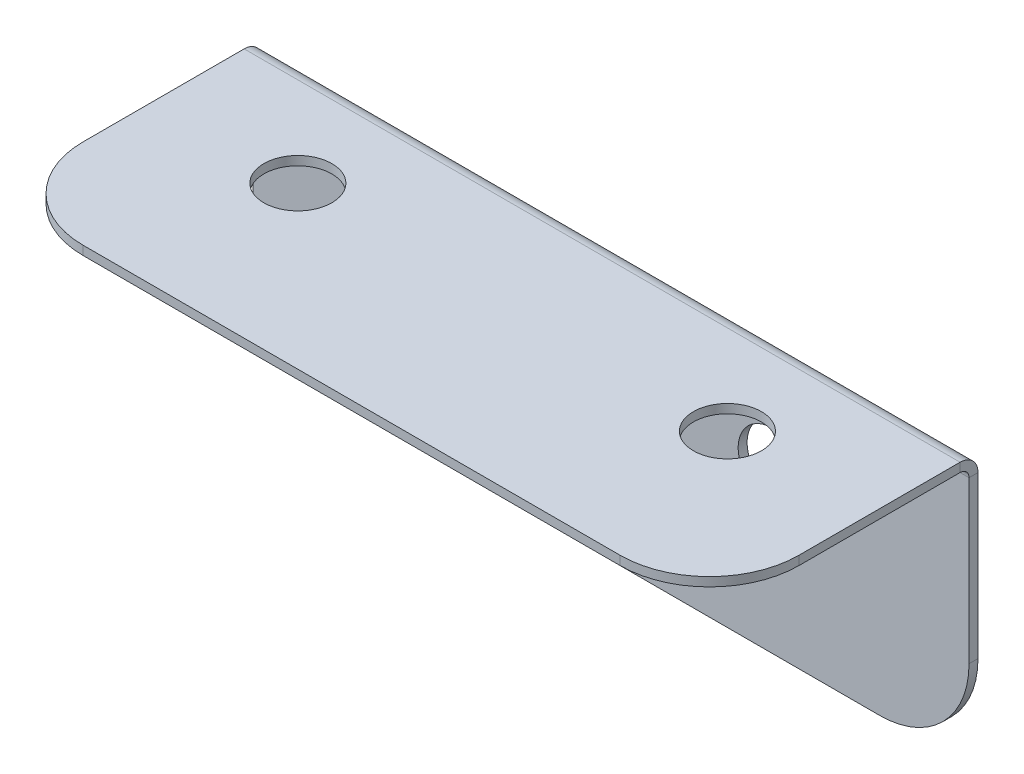
ISO-10303-21;
HEADER;
FILE_DESCRIPTION(('STEP AP214'),'2;1');
FILE_NAME('part.step','',(''),(''),'','','');
FILE_SCHEMA(('AUTOMOTIVE_DESIGN { 1 0 10303 214 1 1 1 1 }'));
ENDSEC;
DATA;
#1=APPLICATION_CONTEXT('core data for automotive mechanical design processes');
#2=APPLICATION_PROTOCOL_DEFINITION('international standard','automotive_design',2000,#1);
#3=PRODUCT_CONTEXT('',#1,'mechanical');
#4=PRODUCT('Part','Part','',(#3));
#5=PRODUCT_RELATED_PRODUCT_CATEGORY('part','',(#4));
#6=PRODUCT_DEFINITION_FORMATION('','',#4);
#7=PRODUCT_DEFINITION_CONTEXT('part definition',#1,'design');
#8=PRODUCT_DEFINITION('design','',#6,#7);
#9=PRODUCT_DEFINITION_SHAPE('','',#8);
#10=(LENGTH_UNIT() NAMED_UNIT(*) SI_UNIT(.MILLI.,.METRE.));
#11=(NAMED_UNIT(*) PLANE_ANGLE_UNIT() SI_UNIT($,.RADIAN.));
#12=(NAMED_UNIT(*) SI_UNIT($,.STERADIAN.) SOLID_ANGLE_UNIT());
#13=UNCERTAINTY_MEASURE_WITH_UNIT(LENGTH_MEASURE(1.E-05),#10,'distance_accuracy_value','');
#14=(GEOMETRIC_REPRESENTATION_CONTEXT(3) GLOBAL_UNCERTAINTY_ASSIGNED_CONTEXT((#13)) GLOBAL_UNIT_ASSIGNED_CONTEXT((#10,
#11,#12)) REPRESENTATION_CONTEXT('',''));
#15=CARTESIAN_POINT('',(0.,0.,0.));
#16=DIRECTION('',(0.,0.,1.));
#17=DIRECTION('',(1.,0.,0.));
#18=AXIS2_PLACEMENT_3D('',#15,#16,#17);
#19=CARTESIAN_POINT('',(20.,-0.5,-10.));
#20=DIRECTION('',(1.,0.,0.));
#21=DIRECTION('',(0.,0.,-1.));
#22=AXIS2_PLACEMENT_3D('',#19,#20,#21);
#23=PLANE('',#22);
#24=DIRECTION('',(0.,0.,-1.));
#25=VECTOR('',#24,1.);
#26=CARTESIAN_POINT('',(20.,0.,-10.));
#27=LINE('',#26,#25);
#28=CARTESIAN_POINT('',(20.,0.,0.));
#29=VERTEX_POINT('',#28);
#30=CARTESIAN_POINT('',(20.,0.,-9.));
#31=VERTEX_POINT('',#30);
#32=EDGE_CURVE('E218',#29,#31,#27,.T.);
#33=ORIENTED_EDGE('',*,*,#32,.F.);
#34=DIRECTION('',(0.,1.,0.));
#35=VECTOR('',#34,1.);
#36=CARTESIAN_POINT('',(20.,-0.5,0.));
#37=LINE('',#36,#35);
#38=CARTESIAN_POINT('',(20.,-0.5,0.));
#39=VERTEX_POINT('',#38);
#40=EDGE_CURVE('E13',#29,#39,#37,.F.);
#41=ORIENTED_EDGE('',*,*,#40,.T.);
#42=DIRECTION('',(0.,0.,-1.));
#43=VECTOR('',#42,1.);
#44=CARTESIAN_POINT('',(20.,-0.5,-10.));
#45=LINE('',#44,#43);
#46=CARTESIAN_POINT('',(20.,-0.500000000000002,-9.));
#47=VERTEX_POINT('',#46);
#48=EDGE_CURVE('E220',#39,#47,#45,.T.);
#49=ORIENTED_EDGE('',*,*,#48,.T.);
#50=DIRECTION('',(0.,1.,0.));
#51=VECTOR('',#50,1.);
#52=CARTESIAN_POINT('',(20.,-0.500000000000002,-9.));
#53=LINE('',#52,#51);
#54=EDGE_CURVE('E202',#47,#31,#53,.T.);
#55=ORIENTED_EDGE('',*,*,#54,.T.);
#56=EDGE_LOOP('',(#33,#41,#49,#55));
#57=FACE_BOUND('',#56,.T.);
#58=ADVANCED_FACE('F61',(#57),#23,.T.);
#59=CARTESIAN_POINT('',(0.,-0.5,0.));
#60=DIRECTION('',(0.,1.,0.));
#61=DIRECTION('',(0.,0.,1.));
#62=AXIS2_PLACEMENT_3D('',#59,#60,#61);
#63=PLANE('',#62);
#64=CARTESIAN_POINT('',(12.,-0.5,-4.));
#65=DIRECTION('',(0.,1.,0.));
#66=DIRECTION('',(0.,0.,1.));
#67=AXIS2_PLACEMENT_3D('',#64,#65,#66);
#68=CIRCLE('',#67,1.89864999999999);
#69=CARTESIAN_POINT('',(12.,-0.5,-2.10135000000001));
#70=VERTEX_POINT('',#69);
#71=EDGE_CURVE('E319',#70,#70,#68,.T.);
#72=ORIENTED_EDGE('',*,*,#71,.T.);
#73=EDGE_LOOP('',(#72));
#74=FACE_BOUND('',#73,.T.);
#75=CARTESIAN_POINT('',(-12.,-0.5,-4.));
#76=DIRECTION('',(0.,1.,0.));
#77=DIRECTION('',(0.,0.,1.));
#78=AXIS2_PLACEMENT_3D('',#75,#76,#77);
#79=CIRCLE('',#78,1.89864999999999);
#80=CARTESIAN_POINT('',(-12.,-0.5,-2.10135000000001));
#81=VERTEX_POINT('',#80);
#82=EDGE_CURVE('E313',#81,#81,#79,.T.);
#83=ORIENTED_EDGE('',*,*,#82,.T.);
#84=EDGE_LOOP('',(#83));
#85=FACE_BOUND('',#84,.T.);
#86=DIRECTION('',(1.,0.,0.));
#87=VECTOR('',#86,1.);
#88=CARTESIAN_POINT('',(-20.,-0.5,5.));
#89=LINE('',#88,#87);
#90=CARTESIAN_POINT('',(-15.,-0.5,5.));
#91=VERTEX_POINT('',#90);
#92=CARTESIAN_POINT('',(15.,-0.5,5.));
#93=VERTEX_POINT('',#92);
#94=EDGE_CURVE('E217',#91,#93,#89,.T.);
#95=ORIENTED_EDGE('',*,*,#94,.F.);
#96=CARTESIAN_POINT('',(-15.,-0.5,0.));
#97=DIRECTION('',(0.,1.,0.));
#98=DIRECTION('',(0.,0.,1.));
#99=AXIS2_PLACEMENT_3D('',#96,#97,#98);
#100=CIRCLE('',#99,5.);
#101=CARTESIAN_POINT('',(-20.,-0.5,0.));
#102=VERTEX_POINT('',#101);
#103=EDGE_CURVE('E69',#91,#102,#100,.F.);
#104=ORIENTED_EDGE('',*,*,#103,.T.);
#105=DIRECTION('',(0.,0.,1.));
#106=VECTOR('',#105,1.);
#107=CARTESIAN_POINT('',(-20.,-0.5,-10.));
#108=LINE('',#107,#106);
#109=CARTESIAN_POINT('',(-20.,-0.500000000000002,-9.));
#110=VERTEX_POINT('',#109);
#111=EDGE_CURVE('E214',#110,#102,#108,.T.);
#112=ORIENTED_EDGE('',*,*,#111,.F.);
#113=DIRECTION('',(1.,0.,0.));
#114=VECTOR('',#113,1.);
#115=CARTESIAN_POINT('',(20.,-0.500000000000002,-9.));
#116=LINE('',#115,#114);
#117=EDGE_CURVE('E206',#47,#110,#116,.F.);
#118=ORIENTED_EDGE('',*,*,#117,.F.);
#119=ORIENTED_EDGE('',*,*,#48,.F.);
#120=CARTESIAN_POINT('',(15.,-0.5,0.));
#121=DIRECTION('',(0.,1.,0.));
#122=DIRECTION('',(0.,0.,1.));
#123=AXIS2_PLACEMENT_3D('',#120,#121,#122);
#124=CIRCLE('',#123,5.);
#125=EDGE_CURVE('E81',#39,#93,#124,.F.);
#126=ORIENTED_EDGE('',*,*,#125,.T.);
#127=EDGE_LOOP('',(#95,#104,#112,#118,#119,#126));
#128=FACE_BOUND('',#127,.T.);
#129=ADVANCED_FACE('F264',(#74,#85,#128),#63,.F.);
#130=CARTESIAN_POINT('',(0.,0.,0.));
#131=DIRECTION('',(0.,1.,0.));
#132=DIRECTION('',(0.,0.,1.));
#133=AXIS2_PLACEMENT_3D('',#130,#131,#132);
#134=PLANE('',#133);
#135=CARTESIAN_POINT('',(12.,0.,-4.));
#136=DIRECTION('',(0.,1.,0.));
#137=DIRECTION('',(0.,0.,1.));
#138=AXIS2_PLACEMENT_3D('',#135,#136,#137);
#139=CIRCLE('',#138,1.89864999999999);
#140=CARTESIAN_POINT('',(12.,0.,-2.10135000000001));
#141=VERTEX_POINT('',#140);
#142=EDGE_CURVE('E322',#141,#141,#139,.T.);
#143=ORIENTED_EDGE('',*,*,#142,.F.);
#144=EDGE_LOOP('',(#143));
#145=FACE_BOUND('',#144,.T.);
#146=CARTESIAN_POINT('',(-12.,0.,-4.));
#147=DIRECTION('',(0.,1.,0.));
#148=DIRECTION('',(0.,0.,1.));
#149=AXIS2_PLACEMENT_3D('',#146,#147,#148);
#150=CIRCLE('',#149,1.89864999999999);
#151=CARTESIAN_POINT('',(-12.,0.,-2.10135000000001));
#152=VERTEX_POINT('',#151);
#153=EDGE_CURVE('E316',#152,#152,#150,.T.);
#154=ORIENTED_EDGE('',*,*,#153,.F.);
#155=EDGE_LOOP('',(#154));
#156=FACE_BOUND('',#155,.T.);
#157=DIRECTION('',(0.,0.,1.));
#158=VECTOR('',#157,1.);
#159=CARTESIAN_POINT('',(-20.,0.,-10.));
#160=LINE('',#159,#158);
#161=CARTESIAN_POINT('',(-20.,0.,-9.));
#162=VERTEX_POINT('',#161);
#163=CARTESIAN_POINT('',(-20.,0.,0.));
#164=VERTEX_POINT('',#163);
#165=EDGE_CURVE('E212',#162,#164,#160,.T.);
#166=ORIENTED_EDGE('',*,*,#165,.T.);
#167=CARTESIAN_POINT('',(-15.,0.,0.));
#168=DIRECTION('',(0.,1.,0.));
#169=DIRECTION('',(0.,0.,1.));
#170=AXIS2_PLACEMENT_3D('',#167,#168,#169);
#171=CIRCLE('',#170,5.);
#172=CARTESIAN_POINT('',(-15.,0.,5.));
#173=VERTEX_POINT('',#172);
#174=EDGE_CURVE('E255',#164,#173,#171,.T.);
#175=ORIENTED_EDGE('',*,*,#174,.T.);
#176=DIRECTION('',(1.,0.,0.));
#177=VECTOR('',#176,1.);
#178=CARTESIAN_POINT('',(-20.,0.,5.));
#179=LINE('',#178,#177);
#180=CARTESIAN_POINT('',(15.,0.,5.));
#181=VERTEX_POINT('',#180);
#182=EDGE_CURVE('E225',#173,#181,#179,.T.);
#183=ORIENTED_EDGE('',*,*,#182,.T.);
#184=CARTESIAN_POINT('',(15.,0.,0.));
#185=DIRECTION('',(0.,1.,0.));
#186=DIRECTION('',(0.,0.,1.));
#187=AXIS2_PLACEMENT_3D('',#184,#185,#186);
#188=CIRCLE('',#187,5.);
#189=EDGE_CURVE('E253',#181,#29,#188,.T.);
#190=ORIENTED_EDGE('',*,*,#189,.T.);
#191=ORIENTED_EDGE('',*,*,#32,.T.);
#192=DIRECTION('',(1.,0.,0.));
#193=VECTOR('',#192,1.);
#194=CARTESIAN_POINT('',(20.,0.,-9.));
#195=LINE('',#194,#193);
#196=EDGE_CURVE('E172',#31,#162,#195,.F.);
#197=ORIENTED_EDGE('',*,*,#196,.T.);
#198=EDGE_LOOP('',(#166,#175,#183,#190,#191,#197));
#199=FACE_BOUND('',#198,.T.);
#200=ADVANCED_FACE('F276',(#145,#156,#199),#134,.T.);
#201=CARTESIAN_POINT('',(-20.,-0.5,-10.));
#202=DIRECTION('',(-1.,0.,0.));
#203=DIRECTION('',(0.,0.,1.));
#204=AXIS2_PLACEMENT_3D('',#201,#202,#203);
#205=PLANE('',#204);
#206=ORIENTED_EDGE('',*,*,#111,.T.);
#207=DIRECTION('',(0.,1.,0.));
#208=VECTOR('',#207,1.);
#209=CARTESIAN_POINT('',(-20.,-0.5,0.));
#210=LINE('',#209,#208);
#211=EDGE_CURVE('E250',#102,#164,#210,.T.);
#212=ORIENTED_EDGE('',*,*,#211,.T.);
#213=ORIENTED_EDGE('',*,*,#165,.F.);
#214=DIRECTION('',(0.,1.,0.));
#215=VECTOR('',#214,1.);
#216=CARTESIAN_POINT('',(-20.,-0.500000000000002,-9.));
#217=LINE('',#216,#215);
#218=EDGE_CURVE('E209',#110,#162,#217,.T.);
#219=ORIENTED_EDGE('',*,*,#218,.F.);
#220=EDGE_LOOP('',(#206,#212,#213,#219));
#221=FACE_BOUND('',#220,.T.);
#222=ADVANCED_FACE('F271',(#221),#205,.T.);
#223=CARTESIAN_POINT('',(-20.,-0.5,5.));
#224=DIRECTION('',(0.,0.,1.));
#225=DIRECTION('',(1.,0.,0.));
#226=AXIS2_PLACEMENT_3D('',#223,#224,#225);
#227=PLANE('',#226);
#228=ORIENTED_EDGE('',*,*,#182,.F.);
#229=DIRECTION('',(0.,1.,0.));
#230=VECTOR('',#229,1.);
#231=CARTESIAN_POINT('',(-15.,-0.5,5.));
#232=LINE('',#231,#230);
#233=EDGE_CURVE('E260',#173,#91,#232,.F.);
#234=ORIENTED_EDGE('',*,*,#233,.T.);
#235=ORIENTED_EDGE('',*,*,#94,.T.);
#236=DIRECTION('',(0.,1.,0.));
#237=VECTOR('',#236,1.);
#238=CARTESIAN_POINT('',(15.,-0.5,5.));
#239=LINE('',#238,#237);
#240=EDGE_CURVE('E257',#93,#181,#239,.T.);
#241=ORIENTED_EDGE('',*,*,#240,.T.);
#242=EDGE_LOOP('',(#228,#234,#235,#241));
#243=FACE_BOUND('',#242,.T.);
#244=ADVANCED_FACE('F278',(#243),#227,.T.);
#245=CARTESIAN_POINT('',(-20.,-1.,-9.));
#246=DIRECTION('',(-1.,0.,0.));
#247=DIRECTION('',(0.,0.,1.));
#248=AXIS2_PLACEMENT_3D('',#245,#246,#247);
#249=PLANE('',#248);
#250=DIRECTION('',(0.,0.,-1.));
#251=VECTOR('',#250,1.);
#252=CARTESIAN_POINT('',(-20.,-0.999999999999996,-9.99999999999995));
#253=LINE('',#252,#251);
#254=CARTESIAN_POINT('',(-20.,-1.,-9.5));
#255=VERTEX_POINT('',#254);
#256=CARTESIAN_POINT('',(-20.,-0.999999999999999,-10.));
#257=VERTEX_POINT('',#256);
#258=EDGE_CURVE('E196',#255,#257,#253,.T.);
#259=ORIENTED_EDGE('',*,*,#258,.F.);
#260=CARTESIAN_POINT('',(-20.,-1.,-9.));
#261=DIRECTION('',(1.,0.,0.));
#262=DIRECTION('',(0.,0.,-1.));
#263=AXIS2_PLACEMENT_3D('',#260,#261,#262);
#264=CIRCLE('',#263,0.5);
#265=EDGE_CURVE('E176',#110,#255,#264,.F.);
#266=ORIENTED_EDGE('',*,*,#265,.F.);
#267=ORIENTED_EDGE('',*,*,#218,.T.);
#268=CARTESIAN_POINT('',(-20.,-1.,-9.));
#269=DIRECTION('',(1.,0.,0.));
#270=DIRECTION('',(0.,0.,-1.));
#271=AXIS2_PLACEMENT_3D('',#268,#269,#270);
#272=CIRCLE('',#271,1.);
#273=EDGE_CURVE('E201',#162,#257,#272,.F.);
#274=ORIENTED_EDGE('',*,*,#273,.T.);
#275=EDGE_LOOP('',(#259,#266,#267,#274));
#276=FACE_BOUND('',#275,.T.);
#277=ADVANCED_FACE('F359',(#276),#249,.T.);
#278=CARTESIAN_POINT('',(20.,-1.,-9.));
#279=DIRECTION('',(-1.,0.,0.));
#280=DIRECTION('',(0.,0.,1.));
#281=AXIS2_PLACEMENT_3D('',#278,#279,#280);
#282=PLANE('',#281);
#283=CARTESIAN_POINT('',(20.,-1.,-9.));
#284=DIRECTION('',(1.,0.,0.));
#285=DIRECTION('',(0.,0.,-1.));
#286=AXIS2_PLACEMENT_3D('',#283,#284,#285);
#287=CIRCLE('',#286,0.5);
#288=CARTESIAN_POINT('',(20.,-1.,-9.5));
#289=VERTEX_POINT('',#288);
#290=EDGE_CURVE('E161',#289,#47,#287,.T.);
#291=ORIENTED_EDGE('',*,*,#290,.F.);
#292=DIRECTION('',(0.,0.,-1.));
#293=VECTOR('',#292,1.);
#294=CARTESIAN_POINT('',(20.,-0.999999999999999,-9.5));
#295=LINE('',#294,#293);
#296=CARTESIAN_POINT('',(20.,-0.999999999999996,-10.));
#297=VERTEX_POINT('',#296);
#298=EDGE_CURVE('E155',#289,#297,#295,.T.);
#299=ORIENTED_EDGE('',*,*,#298,.T.);
#300=CARTESIAN_POINT('',(20.,-1.,-9.));
#301=DIRECTION('',(1.,0.,0.));
#302=DIRECTION('',(0.,0.,-1.));
#303=AXIS2_PLACEMENT_3D('',#300,#301,#302);
#304=CIRCLE('',#303,1.);
#305=EDGE_CURVE('E167',#297,#31,#304,.T.);
#306=ORIENTED_EDGE('',*,*,#305,.T.);
#307=ORIENTED_EDGE('',*,*,#54,.F.);
#308=EDGE_LOOP('',(#291,#299,#306,#307));
#309=FACE_BOUND('',#308,.T.);
#310=ADVANCED_FACE('F179',(#309),#282,.F.);
#311=CARTESIAN_POINT('',(20.,-1.,-9.));
#312=DIRECTION('',(1.,0.,0.));
#313=DIRECTION('',(0.,0.,-1.));
#314=AXIS2_PLACEMENT_3D('',#311,#312,#313);
#315=CYLINDRICAL_SURFACE('',#314,1.);
#316=ORIENTED_EDGE('',*,*,#196,.F.);
#317=ORIENTED_EDGE('',*,*,#305,.F.);
#318=DIRECTION('',(1.,0.,0.));
#319=VECTOR('',#318,1.);
#320=CARTESIAN_POINT('',(0.,-0.999999999999996,-10.));
#321=LINE('',#320,#319);
#322=EDGE_CURVE('E169',#257,#297,#321,.T.);
#323=ORIENTED_EDGE('',*,*,#322,.F.);
#324=ORIENTED_EDGE('',*,*,#273,.F.);
#325=EDGE_LOOP('',(#316,#317,#323,#324));
#326=FACE_BOUND('',#325,.T.);
#327=ADVANCED_FACE('F168',(#326),#315,.T.);
#328=CARTESIAN_POINT('',(20.,-1.,-9.));
#329=DIRECTION('',(1.,0.,0.));
#330=DIRECTION('',(0.,0.,-1.));
#331=AXIS2_PLACEMENT_3D('',#328,#329,#330);
#332=CYLINDRICAL_SURFACE('',#331,0.5);
#333=ORIENTED_EDGE('',*,*,#117,.T.);
#334=ORIENTED_EDGE('',*,*,#265,.T.);
#335=DIRECTION('',(-1.,0.,0.));
#336=VECTOR('',#335,1.);
#337=CARTESIAN_POINT('',(-20.,-0.999999999999999,-9.5));
#338=LINE('',#337,#336);
#339=EDGE_CURVE('E181',#255,#289,#338,.F.);
#340=ORIENTED_EDGE('',*,*,#339,.T.);
#341=ORIENTED_EDGE('',*,*,#290,.T.);
#342=EDGE_LOOP('',(#333,#334,#340,#341));
#343=FACE_BOUND('',#342,.T.);
#344=ADVANCED_FACE('F282',(#343),#332,.F.);
#345=CARTESIAN_POINT('',(20.,-0.499999999999998,-10.));
#346=DIRECTION('',(1.,0.,0.));
#347=DIRECTION('',(0.,0.,-1.));
#348=AXIS2_PLACEMENT_3D('',#345,#346,#347);
#349=PLANE('',#348);
#350=DIRECTION('',(0.,-1.,0.));
#351=VECTOR('',#350,1.);
#352=CARTESIAN_POINT('',(20.,0.,-9.5));
#353=LINE('',#352,#351);
#354=CARTESIAN_POINT('',(20.,-10.,-9.50000000000003));
#355=VERTEX_POINT('',#354);
#356=EDGE_CURVE('E289',#355,#289,#353,.F.);
#357=ORIENTED_EDGE('',*,*,#356,.F.);
#358=DIRECTION('',(0.,0.,1.));
#359=VECTOR('',#358,1.);
#360=CARTESIAN_POINT('',(20.,-10.,-10.));
#361=LINE('',#360,#359);
#362=CARTESIAN_POINT('',(20.,-10.,-10.));
#363=VERTEX_POINT('',#362);
#364=EDGE_CURVE('E157',#355,#363,#361,.F.);
#365=ORIENTED_EDGE('',*,*,#364,.T.);
#366=DIRECTION('',(0.,1.,0.));
#367=VECTOR('',#366,1.);
#368=CARTESIAN_POINT('',(20.,-0.499999999999998,-10.));
#369=LINE('',#368,#367);
#370=EDGE_CURVE('E150',#363,#297,#369,.T.);
#371=ORIENTED_EDGE('',*,*,#370,.T.);
#372=ORIENTED_EDGE('',*,*,#298,.F.);
#373=EDGE_LOOP('',(#357,#365,#371,#372));
#374=FACE_BOUND('',#373,.T.);
#375=ADVANCED_FACE('F153',(#374),#349,.T.);
#376=CARTESIAN_POINT('',(-20.,-15.,-10.));
#377=DIRECTION('',(-1.,0.,0.));
#378=DIRECTION('',(0.,0.,1.));
#379=AXIS2_PLACEMENT_3D('',#376,#377,#378);
#380=PLANE('',#379);
#381=DIRECTION('',(0.,-1.,0.));
#382=VECTOR('',#381,1.);
#383=CARTESIAN_POINT('',(-20.,-15.,-10.));
#384=LINE('',#383,#382);
#385=CARTESIAN_POINT('',(-20.,-10.,-10.));
#386=VERTEX_POINT('',#385);
#387=EDGE_CURVE('E186',#257,#386,#384,.T.);
#388=ORIENTED_EDGE('',*,*,#387,.T.);
#389=DIRECTION('',(0.,0.,1.));
#390=VECTOR('',#389,1.);
#391=CARTESIAN_POINT('',(-20.,-10.,-10.));
#392=LINE('',#391,#390);
#393=CARTESIAN_POINT('',(-20.,-10.,-9.50000000000003));
#394=VERTEX_POINT('',#393);
#395=EDGE_CURVE('E247',#386,#394,#392,.T.);
#396=ORIENTED_EDGE('',*,*,#395,.T.);
#397=DIRECTION('',(0.,1.,0.));
#398=VECTOR('',#397,1.);
#399=CARTESIAN_POINT('',(-20.,0.,-9.5));
#400=LINE('',#399,#398);
#401=EDGE_CURVE('E187',#255,#394,#400,.F.);
#402=ORIENTED_EDGE('',*,*,#401,.F.);
#403=ORIENTED_EDGE('',*,*,#258,.T.);
#404=EDGE_LOOP('',(#388,#396,#402,#403));
#405=FACE_BOUND('',#404,.T.);
#406=ADVANCED_FACE('F291',(#405),#380,.T.);
#407=CARTESIAN_POINT('',(0.,0.,-10.));
#408=DIRECTION('',(0.,0.,-1.));
#409=DIRECTION('',(0.,1.,0.));
#410=AXIS2_PLACEMENT_3D('',#407,#408,#409);
#411=PLANE('',#410);
#412=CARTESIAN_POINT('',(-9.,-6.,-10.));
#413=DIRECTION('',(0.,0.,-1.));
#414=DIRECTION('',(0.,1.,0.));
#415=AXIS2_PLACEMENT_3D('',#412,#413,#414);
#416=CIRCLE('',#415,1.89864999999999);
#417=CARTESIAN_POINT('',(-9.,-4.10135000000001,-10.));
#418=VERTEX_POINT('',#417);
#419=EDGE_CURVE('E229',#418,#418,#416,.T.);
#420=ORIENTED_EDGE('',*,*,#419,.F.);
#421=EDGE_LOOP('',(#420));
#422=FACE_BOUND('',#421,.T.);
#423=CARTESIAN_POINT('',(9.,-6.,-10.));
#424=DIRECTION('',(0.,0.,-1.));
#425=DIRECTION('',(0.,1.,0.));
#426=AXIS2_PLACEMENT_3D('',#423,#424,#425);
#427=CIRCLE('',#426,1.89864999999999);
#428=CARTESIAN_POINT('',(9.,-4.10135000000001,-10.));
#429=VERTEX_POINT('',#428);
#430=EDGE_CURVE('E199',#429,#429,#427,.T.);
#431=ORIENTED_EDGE('',*,*,#430,.F.);
#432=EDGE_LOOP('',(#431));
#433=FACE_BOUND('',#432,.T.);
#434=ORIENTED_EDGE('',*,*,#370,.F.);
#435=CARTESIAN_POINT('',(15.,-10.,-10.));
#436=DIRECTION('',(0.,0.,-1.));
#437=DIRECTION('',(0.,1.,0.));
#438=AXIS2_PLACEMENT_3D('',#435,#436,#437);
#439=CIRCLE('',#438,5.);
#440=CARTESIAN_POINT('',(15.,-15.,-10.));
#441=VERTEX_POINT('',#440);
#442=EDGE_CURVE('E245',#363,#441,#439,.T.);
#443=ORIENTED_EDGE('',*,*,#442,.T.);
#444=DIRECTION('',(1.,0.,0.));
#445=VECTOR('',#444,1.);
#446=CARTESIAN_POINT('',(20.,-15.,-10.));
#447=LINE('',#446,#445);
#448=CARTESIAN_POINT('',(-15.,-15.,-10.));
#449=VERTEX_POINT('',#448);
#450=EDGE_CURVE('E162',#449,#441,#447,.T.);
#451=ORIENTED_EDGE('',*,*,#450,.F.);
#452=CARTESIAN_POINT('',(-15.,-10.,-10.));
#453=DIRECTION('',(0.,0.,-1.));
#454=DIRECTION('',(0.,1.,0.));
#455=AXIS2_PLACEMENT_3D('',#452,#453,#454);
#456=CIRCLE('',#455,5.);
#457=EDGE_CURVE('E243',#449,#386,#456,.T.);
#458=ORIENTED_EDGE('',*,*,#457,.T.);
#459=ORIENTED_EDGE('',*,*,#387,.F.);
#460=ORIENTED_EDGE('',*,*,#322,.T.);
#461=EDGE_LOOP('',(#434,#443,#451,#458,#459,#460));
#462=FACE_BOUND('',#461,.T.);
#463=ADVANCED_FACE('F184',(#422,#433,#462),#411,.T.);
#464=CARTESIAN_POINT('',(0.,0.,-9.5));
#465=DIRECTION('',(0.,0.,-1.));
#466=DIRECTION('',(0.,1.,0.));
#467=AXIS2_PLACEMENT_3D('',#464,#465,#466);
#468=PLANE('',#467);
#469=CARTESIAN_POINT('',(-9.,-6.,-9.5));
#470=DIRECTION('',(0.,0.,1.));
#471=DIRECTION('',(1.,0.,0.));
#472=AXIS2_PLACEMENT_3D('',#469,#470,#471);
#473=CIRCLE('',#472,1.89864999999999);
#474=CARTESIAN_POINT('',(-7.10135000000001,-6.,-9.5));
#475=VERTEX_POINT('',#474);
#476=EDGE_CURVE('E233',#475,#475,#473,.T.);
#477=ORIENTED_EDGE('',*,*,#476,.F.);
#478=EDGE_LOOP('',(#477));
#479=FACE_BOUND('',#478,.T.);
#480=CARTESIAN_POINT('',(9.,-6.,-9.5));
#481=DIRECTION('',(0.,0.,1.));
#482=DIRECTION('',(1.,0.,0.));
#483=AXIS2_PLACEMENT_3D('',#480,#481,#482);
#484=CIRCLE('',#483,1.89864999999999);
#485=CARTESIAN_POINT('',(10.89865,-6.,-9.5));
#486=VERTEX_POINT('',#485);
#487=EDGE_CURVE('E232',#486,#486,#484,.T.);
#488=ORIENTED_EDGE('',*,*,#487,.F.);
#489=EDGE_LOOP('',(#488));
#490=FACE_BOUND('',#489,.T.);
#491=DIRECTION('',(-1.,0.,0.));
#492=VECTOR('',#491,1.);
#493=CARTESIAN_POINT('',(0.,-15.,-9.50000000000005));
#494=LINE('',#493,#492);
#495=CARTESIAN_POINT('',(-15.,-15.,-9.50000000000005));
#496=VERTEX_POINT('',#495);
#497=CARTESIAN_POINT('',(15.,-15.,-9.50000000000005));
#498=VERTEX_POINT('',#497);
#499=EDGE_CURVE('E190',#496,#498,#494,.F.);
#500=ORIENTED_EDGE('',*,*,#499,.T.);
#501=CARTESIAN_POINT('',(15.,-10.,-9.50000000000003));
#502=DIRECTION('',(0.,0.,-1.));
#503=DIRECTION('',(0.,1.,0.));
#504=AXIS2_PLACEMENT_3D('',#501,#502,#503);
#505=CIRCLE('',#504,5.);
#506=EDGE_CURVE('E240',#498,#355,#505,.F.);
#507=ORIENTED_EDGE('',*,*,#506,.T.);
#508=ORIENTED_EDGE('',*,*,#356,.T.);
#509=ORIENTED_EDGE('',*,*,#339,.F.);
#510=ORIENTED_EDGE('',*,*,#401,.T.);
#511=CARTESIAN_POINT('',(-15.,-10.,-9.50000000000003));
#512=DIRECTION('',(0.,0.,-1.));
#513=DIRECTION('',(0.,1.,0.));
#514=AXIS2_PLACEMENT_3D('',#511,#512,#513);
#515=CIRCLE('',#514,5.);
#516=EDGE_CURVE('E238',#394,#496,#515,.F.);
#517=ORIENTED_EDGE('',*,*,#516,.T.);
#518=EDGE_LOOP('',(#500,#507,#508,#509,#510,#517));
#519=FACE_BOUND('',#518,.T.);
#520=ADVANCED_FACE('F288',(#479,#490,#519),#468,.F.);
#521=CARTESIAN_POINT('',(20.,-15.,-10.));
#522=DIRECTION('',(0.,-1.,0.));
#523=DIRECTION('',(0.,0.,-1.));
#524=AXIS2_PLACEMENT_3D('',#521,#522,#523);
#525=PLANE('',#524);
#526=ORIENTED_EDGE('',*,*,#450,.T.);
#527=DIRECTION('',(0.,0.,1.));
#528=VECTOR('',#527,1.);
#529=CARTESIAN_POINT('',(15.,-15.,-10.));
#530=LINE('',#529,#528);
#531=EDGE_CURVE('E235',#441,#498,#530,.T.);
#532=ORIENTED_EDGE('',*,*,#531,.T.);
#533=ORIENTED_EDGE('',*,*,#499,.F.);
#534=DIRECTION('',(0.,0.,1.));
#535=VECTOR('',#534,1.);
#536=CARTESIAN_POINT('',(-15.,-15.,-10.));
#537=LINE('',#536,#535);
#538=EDGE_CURVE('E222',#496,#449,#537,.F.);
#539=ORIENTED_EDGE('',*,*,#538,.T.);
#540=EDGE_LOOP('',(#526,#532,#533,#539));
#541=FACE_BOUND('',#540,.T.);
#542=ADVANCED_FACE('F300',(#541),#525,.T.);
#543=CARTESIAN_POINT('',(9.,-6.,-9.5));
#544=DIRECTION('',(0.,0.,1.));
#545=DIRECTION('',(1.,0.,0.));
#546=AXIS2_PLACEMENT_3D('',#543,#544,#545);
#547=CYLINDRICAL_SURFACE('',#546,1.89864999999999);
#548=ORIENTED_EDGE('',*,*,#430,.T.);
#549=EDGE_LOOP('',(#548));
#550=FACE_BOUND('',#549,.T.);
#551=ORIENTED_EDGE('',*,*,#487,.T.);
#552=EDGE_LOOP('',(#551));
#553=FACE_BOUND('',#552,.T.);
#554=ADVANCED_FACE('F345',(#550,#553),#547,.F.);
#555=CARTESIAN_POINT('',(-9.,-6.,-9.5));
#556=DIRECTION('',(0.,0.,1.));
#557=DIRECTION('',(1.,0.,0.));
#558=AXIS2_PLACEMENT_3D('',#555,#556,#557);
#559=CYLINDRICAL_SURFACE('',#558,1.89864999999999);
#560=ORIENTED_EDGE('',*,*,#419,.T.);
#561=EDGE_LOOP('',(#560));
#562=FACE_BOUND('',#561,.T.);
#563=ORIENTED_EDGE('',*,*,#476,.T.);
#564=EDGE_LOOP('',(#563));
#565=FACE_BOUND('',#564,.T.);
#566=ADVANCED_FACE('F335',(#562,#565),#559,.F.);
#567=CARTESIAN_POINT('',(-12.,0.,-4.));
#568=DIRECTION('',(0.,1.,0.));
#569=DIRECTION('',(0.,0.,1.));
#570=AXIS2_PLACEMENT_3D('',#567,#568,#569);
#571=CYLINDRICAL_SURFACE('',#570,1.89864999999999);
#572=ORIENTED_EDGE('',*,*,#82,.F.);
#573=EDGE_LOOP('',(#572));
#574=FACE_BOUND('',#573,.T.);
#575=ORIENTED_EDGE('',*,*,#153,.T.);
#576=EDGE_LOOP('',(#575));
#577=FACE_BOUND('',#576,.T.);
#578=ADVANCED_FACE('F333',(#574,#577),#571,.F.);
#579=CARTESIAN_POINT('',(12.,0.,-4.));
#580=DIRECTION('',(0.,1.,0.));
#581=DIRECTION('',(0.,0.,1.));
#582=AXIS2_PLACEMENT_3D('',#579,#580,#581);
#583=CYLINDRICAL_SURFACE('',#582,1.89864999999999);
#584=ORIENTED_EDGE('',*,*,#71,.F.);
#585=EDGE_LOOP('',(#584));
#586=FACE_BOUND('',#585,.T.);
#587=ORIENTED_EDGE('',*,*,#142,.T.);
#588=EDGE_LOOP('',(#587));
#589=FACE_BOUND('',#588,.T.);
#590=ADVANCED_FACE('F326',(#586,#589),#583,.F.);
#591=CARTESIAN_POINT('',(15.,-10.,-10.));
#592=DIRECTION('',(0.,0.,1.));
#593=DIRECTION('',(0.,-1.,0.));
#594=AXIS2_PLACEMENT_3D('',#591,#592,#593);
#595=CYLINDRICAL_SURFACE('',#594,5.);
#596=ORIENTED_EDGE('',*,*,#442,.F.);
#597=ORIENTED_EDGE('',*,*,#364,.F.);
#598=ORIENTED_EDGE('',*,*,#506,.F.);
#599=ORIENTED_EDGE('',*,*,#531,.F.);
#600=EDGE_LOOP('',(#596,#597,#598,#599));
#601=FACE_BOUND('',#600,.T.);
#602=ADVANCED_FACE('F342',(#601),#595,.T.);
#603=CARTESIAN_POINT('',(-15.,-10.,-10.));
#604=DIRECTION('',(0.,0.,1.));
#605=DIRECTION('',(0.,-1.,0.));
#606=AXIS2_PLACEMENT_3D('',#603,#604,#605);
#607=CYLINDRICAL_SURFACE('',#606,5.);
#608=ORIENTED_EDGE('',*,*,#457,.F.);
#609=ORIENTED_EDGE('',*,*,#538,.F.);
#610=ORIENTED_EDGE('',*,*,#516,.F.);
#611=ORIENTED_EDGE('',*,*,#395,.F.);
#612=EDGE_LOOP('',(#608,#609,#610,#611));
#613=FACE_BOUND('',#612,.T.);
#614=ADVANCED_FACE('F295',(#613),#607,.T.);
#615=CARTESIAN_POINT('',(-15.,-0.5,0.));
#616=DIRECTION('',(0.,1.,0.));
#617=DIRECTION('',(0.,0.,1.));
#618=AXIS2_PLACEMENT_3D('',#615,#616,#617);
#619=CYLINDRICAL_SURFACE('',#618,5.);
#620=ORIENTED_EDGE('',*,*,#103,.F.);
#621=ORIENTED_EDGE('',*,*,#233,.F.);
#622=ORIENTED_EDGE('',*,*,#174,.F.);
#623=ORIENTED_EDGE('',*,*,#211,.F.);
#624=EDGE_LOOP('',(#620,#621,#622,#623));
#625=FACE_BOUND('',#624,.T.);
#626=ADVANCED_FACE('F273',(#625),#619,.T.);
#627=CARTESIAN_POINT('',(15.,-0.5,0.));
#628=DIRECTION('',(0.,1.,0.));
#629=DIRECTION('',(0.,0.,1.));
#630=AXIS2_PLACEMENT_3D('',#627,#628,#629);
#631=CYLINDRICAL_SURFACE('',#630,5.);
#632=ORIENTED_EDGE('',*,*,#125,.F.);
#633=ORIENTED_EDGE('',*,*,#40,.F.);
#634=ORIENTED_EDGE('',*,*,#189,.F.);
#635=ORIENTED_EDGE('',*,*,#240,.F.);
#636=EDGE_LOOP('',(#632,#633,#634,#635));
#637=FACE_BOUND('',#636,.T.);
#638=ADVANCED_FACE('F63',(#637),#631,.T.);
#639=CLOSED_SHELL('',(#58,#129,#200,#222,#244,#277,#310,#327,#344,#375,#406,#463,#520,#542,#554,
#566,#578,#590,#602,#614,#626,#638));
#640=MANIFOLD_SOLID_BREP('B2',#639);
#641=ADVANCED_BREP_SHAPE_REPRESENTATION('',(#18,#640),#14);
#642=SHAPE_DEFINITION_REPRESENTATION(#9,#641);
ENDSEC;
END-ISO-10303-21;
